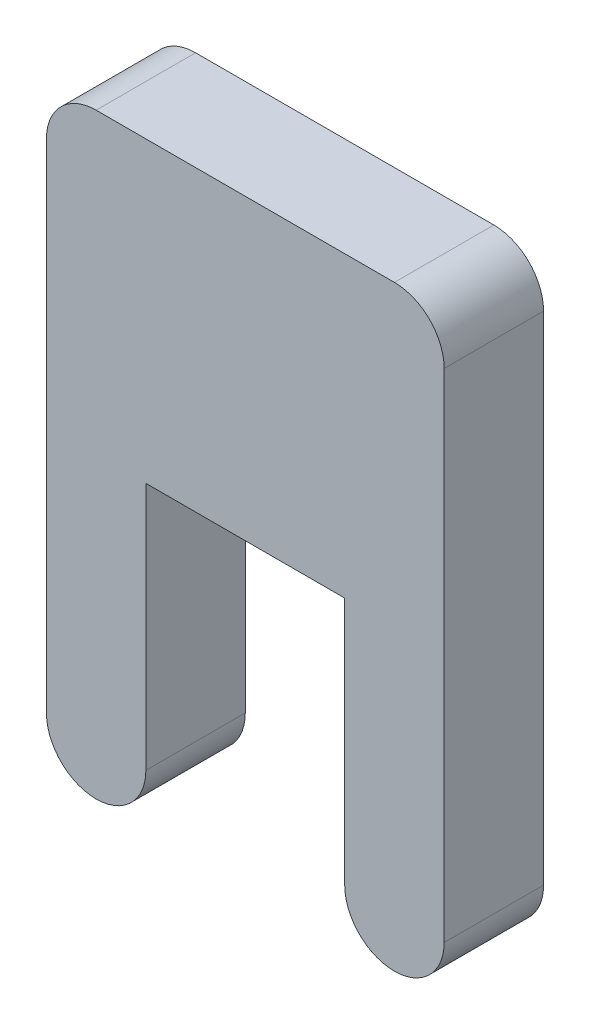
ISO-10303-21;
HEADER;
FILE_DESCRIPTION(('STEP AP214'),'2;1');
FILE_NAME('part.step','',(''),(''),'','','');
FILE_SCHEMA(('AUTOMOTIVE_DESIGN { 1 0 10303 214 1 1 1 1 }'));
ENDSEC;
DATA;
#1=APPLICATION_CONTEXT('core data for automotive mechanical design processes');
#2=APPLICATION_PROTOCOL_DEFINITION('international standard','automotive_design',2000,#1);
#3=PRODUCT_CONTEXT('',#1,'mechanical');
#4=PRODUCT('Part','Part','',(#3));
#5=PRODUCT_RELATED_PRODUCT_CATEGORY('part','',(#4));
#6=PRODUCT_DEFINITION_FORMATION('','',#4);
#7=PRODUCT_DEFINITION_CONTEXT('part definition',#1,'design');
#8=PRODUCT_DEFINITION('design','',#6,#7);
#9=PRODUCT_DEFINITION_SHAPE('','',#8);
#10=(LENGTH_UNIT() NAMED_UNIT(*) SI_UNIT(.MILLI.,.METRE.));
#11=(NAMED_UNIT(*) PLANE_ANGLE_UNIT() SI_UNIT($,.RADIAN.));
#12=(NAMED_UNIT(*) SI_UNIT($,.STERADIAN.) SOLID_ANGLE_UNIT());
#13=UNCERTAINTY_MEASURE_WITH_UNIT(LENGTH_MEASURE(1.E-05),#10,'distance_accuracy_value','');
#14=(GEOMETRIC_REPRESENTATION_CONTEXT(3) GLOBAL_UNCERTAINTY_ASSIGNED_CONTEXT((#13)) GLOBAL_UNIT_ASSIGNED_CONTEXT((#10,
#11,#12)) REPRESENTATION_CONTEXT('',''));
#15=CARTESIAN_POINT('',(0.,0.,0.));
#16=DIRECTION('',(0.,0.,1.));
#17=DIRECTION('',(1.,0.,0.));
#18=AXIS2_PLACEMENT_3D('',#15,#16,#17);
#19=CARTESIAN_POINT('',(0.,0.,1.25));
#20=DIRECTION('',(0.,1.,0.));
#21=DIRECTION('',(0.,0.,1.));
#22=AXIS2_PLACEMENT_3D('',#19,#20,#21);
#23=PLANE('',#22);
#24=DIRECTION('',(1.,0.,0.));
#25=VECTOR('',#24,1.);
#26=CARTESIAN_POINT('',(0.,0.,-1.25));
#27=LINE('',#26,#25);
#28=CARTESIAN_POINT('',(-2.5,0.,-1.25));
#29=VERTEX_POINT('',#28);
#30=CARTESIAN_POINT('',(2.5,0.,-1.25));
#31=VERTEX_POINT('',#30);
#32=EDGE_CURVE('E145',#29,#31,#27,.T.);
#33=ORIENTED_EDGE('',*,*,#32,.T.);
#34=DIRECTION('',(0.,0.,-1.));
#35=VECTOR('',#34,1.);
#36=CARTESIAN_POINT('',(2.5,0.,1.25));
#37=LINE('',#36,#35);
#38=CARTESIAN_POINT('',(2.5,0.,1.25));
#39=VERTEX_POINT('',#38);
#40=EDGE_CURVE('E130',#39,#31,#37,.T.);
#41=ORIENTED_EDGE('',*,*,#40,.F.);
#42=DIRECTION('',(1.,0.,0.));
#43=VECTOR('',#42,1.);
#44=CARTESIAN_POINT('',(0.,0.,1.25));
#45=LINE('',#44,#43);
#46=CARTESIAN_POINT('',(-2.5,0.,1.25));
#47=VERTEX_POINT('',#46);
#48=EDGE_CURVE('E134',#47,#39,#45,.T.);
#49=ORIENTED_EDGE('',*,*,#48,.F.);
#50=DIRECTION('',(0.,0.,-1.));
#51=VECTOR('',#50,1.);
#52=CARTESIAN_POINT('',(-2.5,0.,1.25));
#53=LINE('',#52,#51);
#54=EDGE_CURVE('E147',#47,#29,#53,.T.);
#55=ORIENTED_EDGE('',*,*,#54,.T.);
#56=EDGE_LOOP('',(#33,#41,#49,#55));
#57=FACE_BOUND('',#56,.T.);
#58=ADVANCED_FACE('F33',(#57),#23,.F.);
#59=CARTESIAN_POINT('',(2.5,0.,1.25));
#60=DIRECTION('',(1.,0.,0.));
#61=DIRECTION('',(0.,0.,-1.));
#62=AXIS2_PLACEMENT_3D('',#59,#60,#61);
#63=PLANE('',#62);
#64=DIRECTION('',(0.,-1.,0.));
#65=VECTOR('',#64,1.);
#66=CARTESIAN_POINT('',(2.5,0.,-1.25));
#67=LINE('',#66,#65);
#68=CARTESIAN_POINT('',(2.5,-6.25,-1.25));
#69=VERTEX_POINT('',#68);
#70=EDGE_CURVE('E192',#31,#69,#67,.T.);
#71=ORIENTED_EDGE('',*,*,#70,.T.);
#72=DIRECTION('',(0.,0.,-1.));
#73=VECTOR('',#72,1.);
#74=CARTESIAN_POINT('',(2.5,-6.25,1.25));
#75=LINE('',#74,#73);
#76=CARTESIAN_POINT('',(2.5,-6.25,1.25));
#77=VERTEX_POINT('',#76);
#78=EDGE_CURVE('E11',#69,#77,#75,.F.);
#79=ORIENTED_EDGE('',*,*,#78,.T.);
#80=DIRECTION('',(0.,-1.,0.));
#81=VECTOR('',#80,1.);
#82=CARTESIAN_POINT('',(2.5,0.,1.25));
#83=LINE('',#82,#81);
#84=EDGE_CURVE('E125',#39,#77,#83,.T.);
#85=ORIENTED_EDGE('',*,*,#84,.F.);
#86=ORIENTED_EDGE('',*,*,#40,.T.);
#87=EDGE_LOOP('',(#71,#79,#85,#86));
#88=FACE_BOUND('',#87,.T.);
#89=ADVANCED_FACE('F128',(#88),#63,.F.);
#90=CARTESIAN_POINT('',(5.,0.,1.25));
#91=DIRECTION('',(-1.,0.,0.));
#92=DIRECTION('',(0.,0.,1.));
#93=AXIS2_PLACEMENT_3D('',#90,#91,#92);
#94=PLANE('',#93);
#95=DIRECTION('',(0.,1.,0.));
#96=VECTOR('',#95,1.);
#97=CARTESIAN_POINT('',(5.,0.,-1.25));
#98=LINE('',#97,#96);
#99=CARTESIAN_POINT('',(5.,-6.25,-1.25));
#100=VERTEX_POINT('',#99);
#101=CARTESIAN_POINT('',(5.,6.25,-1.25));
#102=VERTEX_POINT('',#101);
#103=EDGE_CURVE('E220',#100,#102,#98,.T.);
#104=ORIENTED_EDGE('',*,*,#103,.T.);
#105=DIRECTION('',(0.,0.,-1.));
#106=VECTOR('',#105,1.);
#107=CARTESIAN_POINT('',(5.,6.25,1.25));
#108=LINE('',#107,#106);
#109=CARTESIAN_POINT('',(5.,6.25,1.25));
#110=VERTEX_POINT('',#109);
#111=EDGE_CURVE('E42',#102,#110,#108,.F.);
#112=ORIENTED_EDGE('',*,*,#111,.T.);
#113=DIRECTION('',(0.,1.,0.));
#114=VECTOR('',#113,1.);
#115=CARTESIAN_POINT('',(5.,0.,1.25));
#116=LINE('',#115,#114);
#117=CARTESIAN_POINT('',(5.,-6.25,1.25));
#118=VERTEX_POINT('',#117);
#119=EDGE_CURVE('E133',#118,#110,#116,.T.);
#120=ORIENTED_EDGE('',*,*,#119,.F.);
#121=DIRECTION('',(0.,0.,-1.));
#122=VECTOR('',#121,1.);
#123=CARTESIAN_POINT('',(5.,-6.25,1.25));
#124=LINE('',#123,#122);
#125=EDGE_CURVE('E186',#118,#100,#124,.T.);
#126=ORIENTED_EDGE('',*,*,#125,.T.);
#127=EDGE_LOOP('',(#104,#112,#120,#126));
#128=FACE_BOUND('',#127,.T.);
#129=ADVANCED_FACE('F208',(#128),#94,.F.);
#130=CARTESIAN_POINT('',(0.,7.5,1.25));
#131=DIRECTION('',(0.,1.,0.));
#132=DIRECTION('',(0.,0.,1.));
#133=AXIS2_PLACEMENT_3D('',#130,#131,#132);
#134=PLANE('',#133);
#135=DIRECTION('',(1.,0.,0.));
#136=VECTOR('',#135,1.);
#137=CARTESIAN_POINT('',(0.,7.5,-1.25));
#138=LINE('',#137,#136);
#139=CARTESIAN_POINT('',(-3.75,7.5,-1.25));
#140=VERTEX_POINT('',#139);
#141=CARTESIAN_POINT('',(3.75,7.5,-1.25));
#142=VERTEX_POINT('',#141);
#143=EDGE_CURVE('E222',#140,#142,#138,.T.);
#144=ORIENTED_EDGE('',*,*,#143,.F.);
#145=DIRECTION('',(0.,0.,-1.));
#146=VECTOR('',#145,1.);
#147=CARTESIAN_POINT('',(-3.75,7.5,1.25));
#148=LINE('',#147,#146);
#149=CARTESIAN_POINT('',(-3.75,7.5,1.25));
#150=VERTEX_POINT('',#149);
#151=EDGE_CURVE('E184',#140,#150,#148,.F.);
#152=ORIENTED_EDGE('',*,*,#151,.T.);
#153=DIRECTION('',(1.,0.,0.));
#154=VECTOR('',#153,1.);
#155=CARTESIAN_POINT('',(0.,7.5,1.25));
#156=LINE('',#155,#154);
#157=CARTESIAN_POINT('',(3.75,7.5,1.25));
#158=VERTEX_POINT('',#157);
#159=EDGE_CURVE('E211',#150,#158,#156,.T.);
#160=ORIENTED_EDGE('',*,*,#159,.T.);
#161=DIRECTION('',(0.,0.,-1.));
#162=VECTOR('',#161,1.);
#163=CARTESIAN_POINT('',(3.75,7.5,-1.25));
#164=LINE('',#163,#162);
#165=EDGE_CURVE('E181',#158,#142,#164,.T.);
#166=ORIENTED_EDGE('',*,*,#165,.T.);
#167=EDGE_LOOP('',(#144,#152,#160,#166));
#168=FACE_BOUND('',#167,.T.);
#169=ADVANCED_FACE('F259',(#168),#134,.T.);
#170=CARTESIAN_POINT('',(-5.,0.,1.25));
#171=DIRECTION('',(-1.,0.,0.));
#172=DIRECTION('',(0.,0.,1.));
#173=AXIS2_PLACEMENT_3D('',#170,#171,#172);
#174=PLANE('',#173);
#175=DIRECTION('',(0.,1.,0.));
#176=VECTOR('',#175,1.);
#177=CARTESIAN_POINT('',(-5.,0.,-1.25));
#178=LINE('',#177,#176);
#179=CARTESIAN_POINT('',(-5.,-6.25,-1.25));
#180=VERTEX_POINT('',#179);
#181=CARTESIAN_POINT('',(-5.,6.25,-1.25));
#182=VERTEX_POINT('',#181);
#183=EDGE_CURVE('E225',#180,#182,#178,.T.);
#184=ORIENTED_EDGE('',*,*,#183,.F.);
#185=DIRECTION('',(0.,0.,-1.));
#186=VECTOR('',#185,1.);
#187=CARTESIAN_POINT('',(-5.,-6.25,1.25));
#188=LINE('',#187,#186);
#189=CARTESIAN_POINT('',(-5.,-6.25,1.25));
#190=VERTEX_POINT('',#189);
#191=EDGE_CURVE('E179',#180,#190,#188,.F.);
#192=ORIENTED_EDGE('',*,*,#191,.T.);
#193=DIRECTION('',(0.,1.,0.));
#194=VECTOR('',#193,1.);
#195=CARTESIAN_POINT('',(-5.,0.,1.25));
#196=LINE('',#195,#194);
#197=CARTESIAN_POINT('',(-5.,6.25,1.25));
#198=VERTEX_POINT('',#197);
#199=EDGE_CURVE('E214',#190,#198,#196,.T.);
#200=ORIENTED_EDGE('',*,*,#199,.T.);
#201=DIRECTION('',(0.,0.,-1.));
#202=VECTOR('',#201,1.);
#203=CARTESIAN_POINT('',(-5.,6.25,1.25));
#204=LINE('',#203,#202);
#205=EDGE_CURVE('E176',#198,#182,#204,.T.);
#206=ORIENTED_EDGE('',*,*,#205,.T.);
#207=EDGE_LOOP('',(#184,#192,#200,#206));
#208=FACE_BOUND('',#207,.T.);
#209=ADVANCED_FACE('F262',(#208),#174,.T.);
#210=CARTESIAN_POINT('',(-2.5,0.,1.25));
#211=DIRECTION('',(1.,0.,0.));
#212=DIRECTION('',(0.,0.,-1.));
#213=AXIS2_PLACEMENT_3D('',#210,#211,#212);
#214=PLANE('',#213);
#215=DIRECTION('',(0.,-1.,0.));
#216=VECTOR('',#215,1.);
#217=CARTESIAN_POINT('',(-2.5,0.,1.25));
#218=LINE('',#217,#216);
#219=CARTESIAN_POINT('',(-2.5,-6.25,1.25));
#220=VERTEX_POINT('',#219);
#221=EDGE_CURVE('E140',#47,#220,#218,.T.);
#222=ORIENTED_EDGE('',*,*,#221,.T.);
#223=DIRECTION('',(0.,0.,-1.));
#224=VECTOR('',#223,1.);
#225=CARTESIAN_POINT('',(-2.5,-6.25,-1.25));
#226=LINE('',#225,#224);
#227=CARTESIAN_POINT('',(-2.5,-6.25,-1.25));
#228=VERTEX_POINT('',#227);
#229=EDGE_CURVE('E146',#220,#228,#226,.T.);
#230=ORIENTED_EDGE('',*,*,#229,.T.);
#231=DIRECTION('',(0.,-1.,0.));
#232=VECTOR('',#231,1.);
#233=CARTESIAN_POINT('',(-2.5,0.,-1.25));
#234=LINE('',#233,#232);
#235=EDGE_CURVE('E142',#29,#228,#234,.T.);
#236=ORIENTED_EDGE('',*,*,#235,.F.);
#237=ORIENTED_EDGE('',*,*,#54,.F.);
#238=EDGE_LOOP('',(#222,#230,#236,#237));
#239=FACE_BOUND('',#238,.T.);
#240=ADVANCED_FACE('F233',(#239),#214,.T.);
#241=CARTESIAN_POINT('',(0.,0.,1.25));
#242=DIRECTION('',(0.,0.,1.));
#243=DIRECTION('',(1.,0.,0.));
#244=AXIS2_PLACEMENT_3D('',#241,#242,#243);
#245=PLANE('',#244);
#246=CARTESIAN_POINT('',(-3.75,-6.25,1.25));
#247=DIRECTION('',(0.,0.,1.));
#248=DIRECTION('',(1.,0.,0.));
#249=AXIS2_PLACEMENT_3D('',#246,#247,#248);
#250=CIRCLE('',#249,1.25);
#251=CARTESIAN_POINT('',(-3.75,-7.5,1.25));
#252=VERTEX_POINT('',#251);
#253=EDGE_CURVE('E50',#190,#252,#250,.T.);
#254=ORIENTED_EDGE('',*,*,#253,.T.);
#255=CARTESIAN_POINT('',(-3.75,-6.25,1.25));
#256=DIRECTION('',(0.,0.,1.));
#257=DIRECTION('',(1.,0.,0.));
#258=AXIS2_PLACEMENT_3D('',#255,#256,#257);
#259=CIRCLE('',#258,1.25);
#260=EDGE_CURVE('E174',#252,#220,#259,.T.);
#261=ORIENTED_EDGE('',*,*,#260,.T.);
#262=ORIENTED_EDGE('',*,*,#221,.F.);
#263=ORIENTED_EDGE('',*,*,#48,.T.);
#264=ORIENTED_EDGE('',*,*,#84,.T.);
#265=CARTESIAN_POINT('',(3.75,-6.25,1.25));
#266=DIRECTION('',(0.,0.,1.));
#267=DIRECTION('',(1.,0.,0.));
#268=AXIS2_PLACEMENT_3D('',#265,#266,#267);
#269=CIRCLE('',#268,1.25);
#270=CARTESIAN_POINT('',(3.75,-7.5,1.25));
#271=VERTEX_POINT('',#270);
#272=EDGE_CURVE('E168',#77,#271,#269,.T.);
#273=ORIENTED_EDGE('',*,*,#272,.T.);
#274=CARTESIAN_POINT('',(3.75,-6.25,1.25));
#275=DIRECTION('',(0.,0.,1.));
#276=DIRECTION('',(1.,0.,0.));
#277=AXIS2_PLACEMENT_3D('',#274,#275,#276);
#278=CIRCLE('',#277,1.25);
#279=EDGE_CURVE('E166',#271,#118,#278,.T.);
#280=ORIENTED_EDGE('',*,*,#279,.T.);
#281=ORIENTED_EDGE('',*,*,#119,.T.);
#282=CARTESIAN_POINT('',(3.75,6.25,1.25));
#283=DIRECTION('',(0.,0.,1.));
#284=DIRECTION('',(1.,0.,0.));
#285=AXIS2_PLACEMENT_3D('',#282,#283,#284);
#286=CIRCLE('',#285,1.25);
#287=EDGE_CURVE('E170',#110,#158,#286,.T.);
#288=ORIENTED_EDGE('',*,*,#287,.T.);
#289=ORIENTED_EDGE('',*,*,#159,.F.);
#290=CARTESIAN_POINT('',(-3.75,6.25,1.25));
#291=DIRECTION('',(0.,0.,1.));
#292=DIRECTION('',(1.,0.,0.));
#293=AXIS2_PLACEMENT_3D('',#290,#291,#292);
#294=CIRCLE('',#293,1.25);
#295=EDGE_CURVE('E56',#150,#198,#294,.T.);
#296=ORIENTED_EDGE('',*,*,#295,.T.);
#297=ORIENTED_EDGE('',*,*,#199,.F.);
#298=EDGE_LOOP('',(#254,#261,#262,#263,#264,#273,#280,#281,#288,#289,#296,#297));
#299=FACE_BOUND('',#298,.T.);
#300=ADVANCED_FACE('F138',(#299),#245,.T.);
#301=CARTESIAN_POINT('',(0.,0.,-1.25));
#302=DIRECTION('',(0.,0.,1.));
#303=DIRECTION('',(1.,0.,0.));
#304=AXIS2_PLACEMENT_3D('',#301,#302,#303);
#305=PLANE('',#304);
#306=ORIENTED_EDGE('',*,*,#235,.T.);
#307=CARTESIAN_POINT('',(-3.75,-6.25,-1.25));
#308=DIRECTION('',(0.,0.,1.));
#309=DIRECTION('',(1.,0.,0.));
#310=AXIS2_PLACEMENT_3D('',#307,#308,#309);
#311=CIRCLE('',#310,1.25);
#312=CARTESIAN_POINT('',(-3.75,-7.5,-1.25));
#313=VERTEX_POINT('',#312);
#314=EDGE_CURVE('E164',#228,#313,#311,.F.);
#315=ORIENTED_EDGE('',*,*,#314,.T.);
#316=CARTESIAN_POINT('',(-3.75,-6.25,-1.25));
#317=DIRECTION('',(0.,0.,1.));
#318=DIRECTION('',(1.,0.,0.));
#319=AXIS2_PLACEMENT_3D('',#316,#317,#318);
#320=CIRCLE('',#319,1.25);
#321=EDGE_CURVE('E162',#313,#180,#320,.F.);
#322=ORIENTED_EDGE('',*,*,#321,.T.);
#323=ORIENTED_EDGE('',*,*,#183,.T.);
#324=CARTESIAN_POINT('',(-3.75,6.25,-1.25));
#325=DIRECTION('',(0.,0.,1.));
#326=DIRECTION('',(1.,0.,0.));
#327=AXIS2_PLACEMENT_3D('',#324,#325,#326);
#328=CIRCLE('',#327,1.25);
#329=EDGE_CURVE('E160',#182,#140,#328,.F.);
#330=ORIENTED_EDGE('',*,*,#329,.T.);
#331=ORIENTED_EDGE('',*,*,#143,.T.);
#332=CARTESIAN_POINT('',(3.75,6.25,-1.25));
#333=DIRECTION('',(0.,0.,1.));
#334=DIRECTION('',(1.,0.,0.));
#335=AXIS2_PLACEMENT_3D('',#332,#333,#334);
#336=CIRCLE('',#335,1.25);
#337=EDGE_CURVE('E158',#142,#102,#336,.F.);
#338=ORIENTED_EDGE('',*,*,#337,.T.);
#339=ORIENTED_EDGE('',*,*,#103,.F.);
#340=CARTESIAN_POINT('',(3.75,-6.25,-1.25));
#341=DIRECTION('',(0.,0.,1.));
#342=DIRECTION('',(1.,0.,0.));
#343=AXIS2_PLACEMENT_3D('',#340,#341,#342);
#344=CIRCLE('',#343,1.25);
#345=CARTESIAN_POINT('',(3.75,-7.5,-1.25));
#346=VERTEX_POINT('',#345);
#347=EDGE_CURVE('E150',#100,#346,#344,.F.);
#348=ORIENTED_EDGE('',*,*,#347,.T.);
#349=CARTESIAN_POINT('',(3.75,-6.25,-1.25));
#350=DIRECTION('',(0.,0.,1.));
#351=DIRECTION('',(1.,0.,0.));
#352=AXIS2_PLACEMENT_3D('',#349,#350,#351);
#353=CIRCLE('',#352,1.25);
#354=EDGE_CURVE('E156',#346,#69,#353,.F.);
#355=ORIENTED_EDGE('',*,*,#354,.T.);
#356=ORIENTED_EDGE('',*,*,#70,.F.);
#357=ORIENTED_EDGE('',*,*,#32,.F.);
#358=EDGE_LOOP('',(#306,#315,#322,#323,#330,#331,#338,#339,#348,#355,#356,#357));
#359=FACE_BOUND('',#358,.T.);
#360=ADVANCED_FACE('F230',(#359),#305,.F.);
#361=CARTESIAN_POINT('',(-3.75,-6.25,1.25));
#362=DIRECTION('',(0.,0.,1.));
#363=DIRECTION('',(1.,0.,0.));
#364=AXIS2_PLACEMENT_3D('',#361,#362,#363);
#365=CYLINDRICAL_SURFACE('',#364,1.25);
#366=DIRECTION('',(0.,0.,-1.));
#367=VECTOR('',#366,1.);
#368=CARTESIAN_POINT('',(-3.75,-7.5,-1.25));
#369=LINE('',#368,#367);
#370=EDGE_CURVE('E188',#252,#313,#369,.T.);
#371=ORIENTED_EDGE('',*,*,#370,.F.);
#372=ORIENTED_EDGE('',*,*,#253,.F.);
#373=ORIENTED_EDGE('',*,*,#191,.F.);
#374=ORIENTED_EDGE('',*,*,#321,.F.);
#375=EDGE_LOOP('',(#371,#372,#373,#374));
#376=FACE_BOUND('',#375,.T.);
#377=ADVANCED_FACE('F238',(#376),#365,.T.);
#378=CARTESIAN_POINT('',(-3.75,-6.25,1.25));
#379=DIRECTION('',(0.,0.,1.));
#380=DIRECTION('',(1.,0.,0.));
#381=AXIS2_PLACEMENT_3D('',#378,#379,#380);
#382=CYLINDRICAL_SURFACE('',#381,1.25);
#383=ORIENTED_EDGE('',*,*,#260,.F.);
#384=ORIENTED_EDGE('',*,*,#370,.T.);
#385=ORIENTED_EDGE('',*,*,#314,.F.);
#386=ORIENTED_EDGE('',*,*,#229,.F.);
#387=EDGE_LOOP('',(#383,#384,#385,#386));
#388=FACE_BOUND('',#387,.T.);
#389=ADVANCED_FACE('F235',(#388),#382,.T.);
#390=CARTESIAN_POINT('',(-3.75,6.25,1.25));
#391=DIRECTION('',(0.,0.,-1.));
#392=DIRECTION('',(-1.,0.,0.));
#393=AXIS2_PLACEMENT_3D('',#390,#391,#392);
#394=CYLINDRICAL_SURFACE('',#393,1.25);
#395=ORIENTED_EDGE('',*,*,#295,.F.);
#396=ORIENTED_EDGE('',*,*,#151,.F.);
#397=ORIENTED_EDGE('',*,*,#329,.F.);
#398=ORIENTED_EDGE('',*,*,#205,.F.);
#399=EDGE_LOOP('',(#395,#396,#397,#398));
#400=FACE_BOUND('',#399,.T.);
#401=ADVANCED_FACE('F237',(#400),#394,.T.);
#402=CARTESIAN_POINT('',(3.75,6.25,1.25));
#403=DIRECTION('',(0.,0.,1.));
#404=DIRECTION('',(1.,0.,0.));
#405=AXIS2_PLACEMENT_3D('',#402,#403,#404);
#406=CYLINDRICAL_SURFACE('',#405,1.25);
#407=ORIENTED_EDGE('',*,*,#287,.F.);
#408=ORIENTED_EDGE('',*,*,#111,.F.);
#409=ORIENTED_EDGE('',*,*,#337,.F.);
#410=ORIENTED_EDGE('',*,*,#165,.F.);
#411=EDGE_LOOP('',(#407,#408,#409,#410));
#412=FACE_BOUND('',#411,.T.);
#413=ADVANCED_FACE('F244',(#412),#406,.T.);
#414=CARTESIAN_POINT('',(3.75,-6.25,1.25));
#415=DIRECTION('',(0.,0.,-1.));
#416=DIRECTION('',(-1.,0.,0.));
#417=AXIS2_PLACEMENT_3D('',#414,#415,#416);
#418=CYLINDRICAL_SURFACE('',#417,1.25);
#419=ORIENTED_EDGE('',*,*,#125,.F.);
#420=ORIENTED_EDGE('',*,*,#279,.F.);
#421=DIRECTION('',(0.,0.,-1.));
#422=VECTOR('',#421,1.);
#423=CARTESIAN_POINT('',(3.75,-7.5,1.25));
#424=LINE('',#423,#422);
#425=EDGE_CURVE('E37',#346,#271,#424,.F.);
#426=ORIENTED_EDGE('',*,*,#425,.F.);
#427=ORIENTED_EDGE('',*,*,#347,.F.);
#428=EDGE_LOOP('',(#419,#420,#426,#427));
#429=FACE_BOUND('',#428,.T.);
#430=ADVANCED_FACE('F35',(#429),#418,.T.);
#431=CARTESIAN_POINT('',(3.75,-6.25,1.25));
#432=DIRECTION('',(0.,0.,-1.));
#433=DIRECTION('',(-1.,0.,0.));
#434=AXIS2_PLACEMENT_3D('',#431,#432,#433);
#435=CYLINDRICAL_SURFACE('',#434,1.25);
#436=ORIENTED_EDGE('',*,*,#272,.F.);
#437=ORIENTED_EDGE('',*,*,#78,.F.);
#438=ORIENTED_EDGE('',*,*,#354,.F.);
#439=ORIENTED_EDGE('',*,*,#425,.T.);
#440=EDGE_LOOP('',(#436,#437,#438,#439));
#441=FACE_BOUND('',#440,.T.);
#442=ADVANCED_FACE('F198',(#441),#435,.T.);
#443=CLOSED_SHELL('',(#58,#89,#129,#169,#209,#240,#300,#360,#377,#389,#401,#413,#430,#442));
#444=MANIFOLD_SOLID_BREP('B2',#443);
#445=ADVANCED_BREP_SHAPE_REPRESENTATION('',(#18,#444),#14);
#446=SHAPE_DEFINITION_REPRESENTATION(#9,#445);
ENDSEC;
END-ISO-10303-21;
